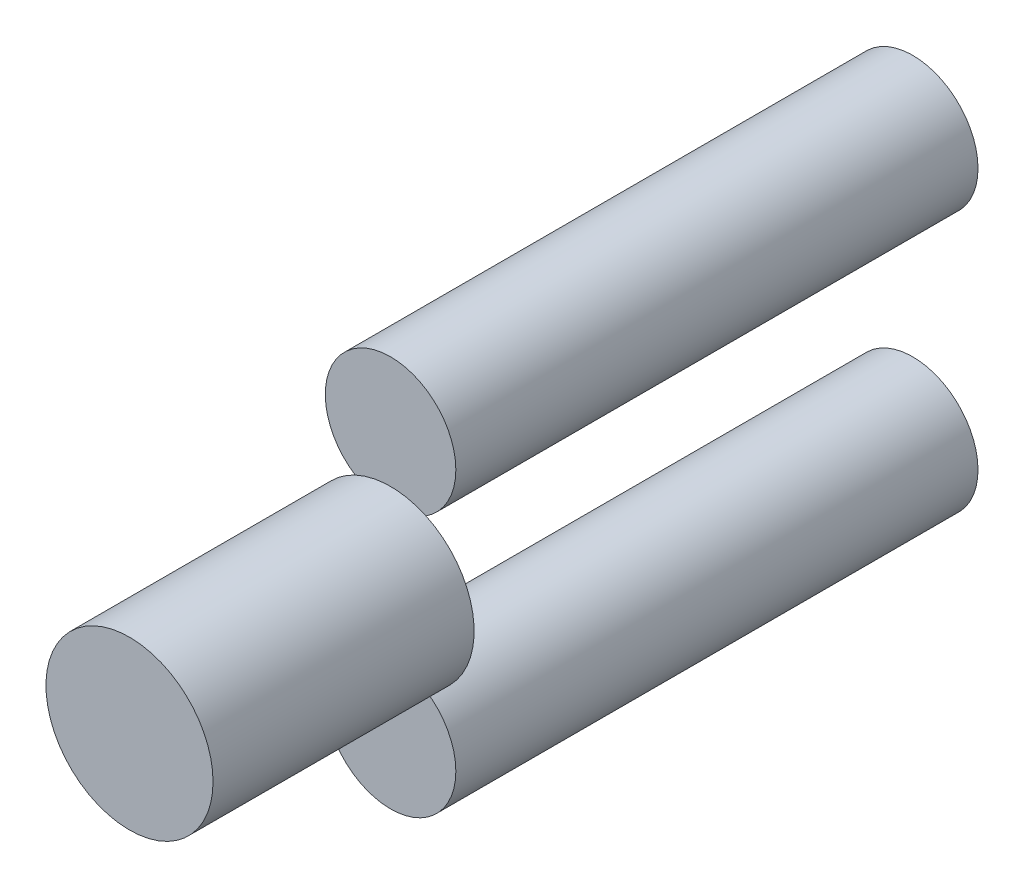
ISO-10303-21;
HEADER;
FILE_DESCRIPTION(('STEP AP214'),'2;1');
FILE_NAME('part.step','',(''),(''),'','','');
FILE_SCHEMA(('AUTOMOTIVE_DESIGN { 1 0 10303 214 1 1 1 1 }'));
ENDSEC;
DATA;
#1=APPLICATION_CONTEXT('core data for automotive mechanical design processes');
#2=APPLICATION_PROTOCOL_DEFINITION('international standard','automotive_design',2000,#1);
#3=PRODUCT_CONTEXT('',#1,'mechanical');
#4=PRODUCT('Part','Part','',(#3));
#5=PRODUCT_RELATED_PRODUCT_CATEGORY('part','',(#4));
#6=PRODUCT_DEFINITION_FORMATION('','',#4);
#7=PRODUCT_DEFINITION_CONTEXT('part definition',#1,'design');
#8=PRODUCT_DEFINITION('design','',#6,#7);
#9=PRODUCT_DEFINITION_SHAPE('','',#8);
#10=(LENGTH_UNIT() NAMED_UNIT(*) SI_UNIT(.MILLI.,.METRE.));
#11=(NAMED_UNIT(*) PLANE_ANGLE_UNIT() SI_UNIT($,.RADIAN.));
#12=(NAMED_UNIT(*) SI_UNIT($,.STERADIAN.) SOLID_ANGLE_UNIT());
#13=UNCERTAINTY_MEASURE_WITH_UNIT(LENGTH_MEASURE(1.E-05),#10,'distance_accuracy_value','');
#14=(GEOMETRIC_REPRESENTATION_CONTEXT(3) GLOBAL_UNCERTAINTY_ASSIGNED_CONTEXT((#13)) GLOBAL_UNIT_ASSIGNED_CONTEXT((#10,
#11,#12)) REPRESENTATION_CONTEXT('',''));
#15=CARTESIAN_POINT('',(0.,0.,0.));
#16=DIRECTION('',(0.,0.,1.));
#17=DIRECTION('',(1.,0.,0.));
#18=AXIS2_PLACEMENT_3D('',#15,#16,#17);
#19=CARTESIAN_POINT('',(0.,12.7,-12.7));
#20=DIRECTION('',(0.,0.,1.));
#21=DIRECTION('',(1.,0.,0.));
#22=AXIS2_PLACEMENT_3D('',#19,#20,#21);
#23=CYLINDRICAL_SURFACE('',#22,1.5875);
#24=CARTESIAN_POINT('',(0.,12.7,-12.7));
#25=DIRECTION('',(0.,0.,1.));
#26=DIRECTION('',(1.,0.,0.));
#27=AXIS2_PLACEMENT_3D('',#24,#25,#26);
#28=CIRCLE('',#27,1.5875);
#29=CARTESIAN_POINT('',(1.5875,12.7,-12.7));
#30=VERTEX_POINT('',#29);
#31=EDGE_CURVE('E11',#30,#30,#28,.T.);
#32=ORIENTED_EDGE('',*,*,#31,.T.);
#33=EDGE_LOOP('',(#32));
#34=FACE_BOUND('',#33,.T.);
#35=CARTESIAN_POINT('',(0.,12.7,0.));
#36=DIRECTION('',(0.,0.,1.));
#37=DIRECTION('',(1.,0.,0.));
#38=AXIS2_PLACEMENT_3D('',#35,#36,#37);
#39=CIRCLE('',#38,1.5875);
#40=CARTESIAN_POINT('',(0.860372042650735,14.034135,0.));
#41=VERTEX_POINT('',#40);
#42=CARTESIAN_POINT('',(-0.860372042650735,14.034135,0.));
#43=VERTEX_POINT('',#42);
#44=EDGE_CURVE('E46',#41,#43,#39,.T.);
#45=ORIENTED_EDGE('',*,*,#44,.F.);
#46=EDGE_CURVE('E101',#43,#41,#39,.T.);
#47=ORIENTED_EDGE('',*,*,#46,.F.);
#48=EDGE_LOOP('',(#45,#47));
#49=FACE_BOUND('',#48,.T.);
#50=ADVANCED_FACE('F43',(#34,#49),#23,.T.);
#51=CARTESIAN_POINT('',(0.,12.7,-12.7));
#52=DIRECTION('',(0.,0.,1.));
#53=DIRECTION('',(1.,0.,0.));
#54=AXIS2_PLACEMENT_3D('',#51,#52,#53);
#55=PLANE('',#54);
#56=ORIENTED_EDGE('',*,*,#31,.F.);
#57=EDGE_LOOP('',(#56));
#58=FACE_BOUND('',#57,.T.);
#59=ADVANCED_FACE('F120',(#58),#55,.F.);
#60=CARTESIAN_POINT('',(0.,12.7,0.));
#61=DIRECTION('',(0.,0.,1.));
#62=DIRECTION('',(1.,0.,0.));
#63=AXIS2_PLACEMENT_3D('',#60,#61,#62);
#64=PLANE('',#63);
#65=CARTESIAN_POINT('',(0.,15.875,0.));
#66=DIRECTION('',(0.,0.,1.));
#67=DIRECTION('',(1.,0.,0.));
#68=AXIS2_PLACEMENT_3D('',#65,#66,#67);
#69=CIRCLE('',#68,2.032);
#70=EDGE_CURVE('E94',#43,#41,#69,.T.);
#71=ORIENTED_EDGE('',*,*,#70,.F.);
#72=ORIENTED_EDGE('',*,*,#46,.T.);
#73=EDGE_LOOP('',(#71,#72));
#74=FACE_BOUND('',#73,.T.);
#75=ADVANCED_FACE('F125',(#74),#64,.T.);
#76=CARTESIAN_POINT('',(0.,15.875,0.));
#77=DIRECTION('',(0.,0.,1.));
#78=DIRECTION('',(1.,0.,0.));
#79=AXIS2_PLACEMENT_3D('',#76,#77,#78);
#80=PLANE('',#79);
#81=CARTESIAN_POINT('',(-0.860372042650737,17.715865,0.));
#82=VERTEX_POINT('',#81);
#83=EDGE_CURVE('E69',#82,#43,#69,.T.);
#84=ORIENTED_EDGE('',*,*,#83,.F.);
#85=CARTESIAN_POINT('',(0.,19.05,0.));
#86=DIRECTION('',(0.,0.,1.));
#87=DIRECTION('',(1.,0.,0.));
#88=AXIS2_PLACEMENT_3D('',#85,#86,#87);
#89=CIRCLE('',#88,1.5875);
#90=CARTESIAN_POINT('',(0.860372042650738,17.715865,0.));
#91=VERTEX_POINT('',#90);
#92=EDGE_CURVE('E59',#82,#91,#89,.T.);
#93=ORIENTED_EDGE('',*,*,#92,.T.);
#94=EDGE_CURVE('E82',#41,#91,#69,.T.);
#95=ORIENTED_EDGE('',*,*,#94,.F.);
#96=ORIENTED_EDGE('',*,*,#44,.T.);
#97=EDGE_LOOP('',(#84,#93,#95,#96));
#98=FACE_BOUND('',#97,.T.);
#99=ADVANCED_FACE('F89',(#98),#80,.F.);
#100=CARTESIAN_POINT('',(0.,15.875,6.35));
#101=DIRECTION('',(0.,0.,-1.));
#102=DIRECTION('',(-1.,0.,0.));
#103=AXIS2_PLACEMENT_3D('',#100,#101,#102);
#104=CYLINDRICAL_SURFACE('',#103,2.032);
#105=CARTESIAN_POINT('',(0.,15.875,6.35));
#106=DIRECTION('',(0.,0.,1.));
#107=DIRECTION('',(1.,0.,0.));
#108=AXIS2_PLACEMENT_3D('',#105,#106,#107);
#109=CIRCLE('',#108,2.032);
#110=CARTESIAN_POINT('',(2.032,15.875,6.35));
#111=VERTEX_POINT('',#110);
#112=EDGE_CURVE('E97',#111,#111,#109,.T.);
#113=ORIENTED_EDGE('',*,*,#112,.F.);
#114=EDGE_LOOP('',(#113));
#115=FACE_BOUND('',#114,.T.);
#116=ORIENTED_EDGE('',*,*,#70,.T.);
#117=ORIENTED_EDGE('',*,*,#94,.T.);
#118=EDGE_CURVE('E77',#91,#82,#69,.T.);
#119=ORIENTED_EDGE('',*,*,#118,.T.);
#120=ORIENTED_EDGE('',*,*,#83,.T.);
#121=EDGE_LOOP('',(#116,#117,#119,#120));
#122=FACE_BOUND('',#121,.T.);
#123=ADVANCED_FACE('F93',(#115,#122),#104,.T.);
#124=CARTESIAN_POINT('',(0.,15.875,6.35));
#125=DIRECTION('',(0.,0.,1.));
#126=DIRECTION('',(1.,0.,0.));
#127=AXIS2_PLACEMENT_3D('',#124,#125,#126);
#128=PLANE('',#127);
#129=ORIENTED_EDGE('',*,*,#112,.T.);
#130=EDGE_LOOP('',(#129));
#131=FACE_BOUND('',#130,.T.);
#132=ADVANCED_FACE('F117',(#131),#128,.T.);
#133=CARTESIAN_POINT('',(0.,19.05,-12.7));
#134=DIRECTION('',(0.,0.,1.));
#135=DIRECTION('',(1.,0.,0.));
#136=AXIS2_PLACEMENT_3D('',#133,#134,#135);
#137=CYLINDRICAL_SURFACE('',#136,1.5875);
#138=CARTESIAN_POINT('',(0.,19.05,-12.7));
#139=DIRECTION('',(0.,0.,1.));
#140=DIRECTION('',(1.,0.,0.));
#141=AXIS2_PLACEMENT_3D('',#138,#139,#140);
#142=CIRCLE('',#141,1.5875);
#143=CARTESIAN_POINT('',(1.5875,19.05,-12.7));
#144=VERTEX_POINT('',#143);
#145=EDGE_CURVE('E92',#144,#144,#142,.T.);
#146=ORIENTED_EDGE('',*,*,#145,.T.);
#147=EDGE_LOOP('',(#146));
#148=FACE_BOUND('',#147,.T.);
#149=ORIENTED_EDGE('',*,*,#92,.F.);
#150=EDGE_CURVE('E79',#91,#82,#89,.T.);
#151=ORIENTED_EDGE('',*,*,#150,.F.);
#152=EDGE_LOOP('',(#149,#151));
#153=FACE_BOUND('',#152,.T.);
#154=ADVANCED_FACE('F84',(#148,#153),#137,.T.);
#155=CARTESIAN_POINT('',(0.,19.05,-12.7));
#156=DIRECTION('',(0.,0.,1.));
#157=DIRECTION('',(1.,0.,0.));
#158=AXIS2_PLACEMENT_3D('',#155,#156,#157);
#159=PLANE('',#158);
#160=ORIENTED_EDGE('',*,*,#145,.F.);
#161=EDGE_LOOP('',(#160));
#162=FACE_BOUND('',#161,.T.);
#163=ADVANCED_FACE('F109',(#162),#159,.F.);
#164=CARTESIAN_POINT('',(0.,19.05,0.));
#165=DIRECTION('',(0.,0.,1.));
#166=DIRECTION('',(1.,0.,0.));
#167=AXIS2_PLACEMENT_3D('',#164,#165,#166);
#168=PLANE('',#167);
#169=ORIENTED_EDGE('',*,*,#118,.F.);
#170=ORIENTED_EDGE('',*,*,#150,.T.);
#171=EDGE_LOOP('',(#169,#170));
#172=FACE_BOUND('',#171,.T.);
#173=ADVANCED_FACE('F78',(#172),#168,.T.);
#174=CLOSED_SHELL('',(#50,#59,#75,#99,#123,#132,#154,#163,#173));
#175=MANIFOLD_SOLID_BREP('B2',#174);
#176=ADVANCED_BREP_SHAPE_REPRESENTATION('',(#18,#175),#14);
#177=SHAPE_DEFINITION_REPRESENTATION(#9,#176);
ENDSEC;
END-ISO-10303-21;
